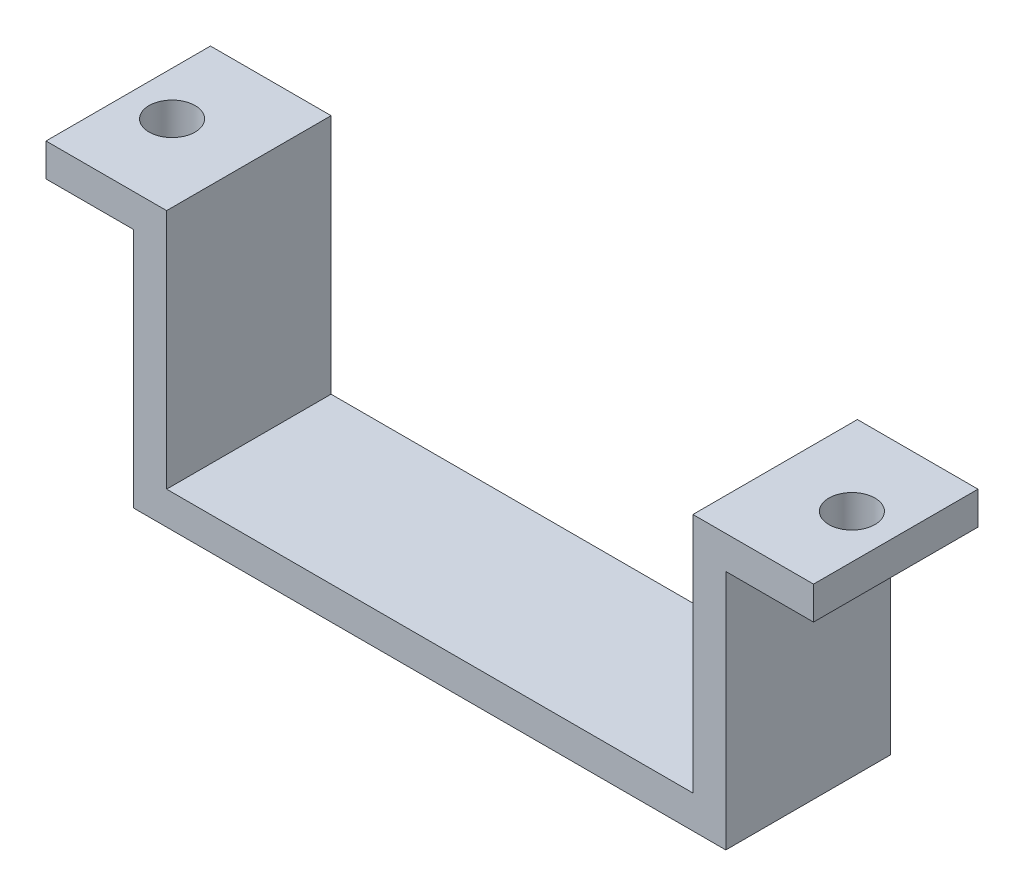
ISO-10303-21;
HEADER;
FILE_DESCRIPTION(('STEP AP214'),'2;1');
FILE_NAME('part.step','',(''),(''),'','','');
FILE_SCHEMA(('AUTOMOTIVE_DESIGN { 1 0 10303 214 1 1 1 1 }'));
ENDSEC;
DATA;
#1=APPLICATION_CONTEXT('core data for automotive mechanical design processes');
#2=APPLICATION_PROTOCOL_DEFINITION('international standard','automotive_design',2000,#1);
#3=PRODUCT_CONTEXT('',#1,'mechanical');
#4=PRODUCT('Part','Part','',(#3));
#5=PRODUCT_RELATED_PRODUCT_CATEGORY('part','',(#4));
#6=PRODUCT_DEFINITION_FORMATION('','',#4);
#7=PRODUCT_DEFINITION_CONTEXT('part definition',#1,'design');
#8=PRODUCT_DEFINITION('design','',#6,#7);
#9=PRODUCT_DEFINITION_SHAPE('','',#8);
#10=(LENGTH_UNIT() NAMED_UNIT(*) SI_UNIT(.MILLI.,.METRE.));
#11=(NAMED_UNIT(*) PLANE_ANGLE_UNIT() SI_UNIT($,.RADIAN.));
#12=(NAMED_UNIT(*) SI_UNIT($,.STERADIAN.) SOLID_ANGLE_UNIT());
#13=UNCERTAINTY_MEASURE_WITH_UNIT(LENGTH_MEASURE(1.E-05),#10,'distance_accuracy_value','');
#14=(GEOMETRIC_REPRESENTATION_CONTEXT(3) GLOBAL_UNCERTAINTY_ASSIGNED_CONTEXT((#13)) GLOBAL_UNIT_ASSIGNED_CONTEXT((#10,
#11,#12)) REPRESENTATION_CONTEXT('',''));
#15=CARTESIAN_POINT('',(0.,0.,0.));
#16=DIRECTION('',(0.,0.,1.));
#17=DIRECTION('',(1.,0.,0.));
#18=AXIS2_PLACEMENT_3D('',#15,#16,#17);
#19=CARTESIAN_POINT('',(27.,25.,-7.5));
#20=DIRECTION('',(-1.,0.,0.));
#21=DIRECTION('',(0.,0.,1.));
#22=AXIS2_PLACEMENT_3D('',#19,#20,#21);
#23=PLANE('',#22);
#24=DIRECTION('',(0.,0.,-1.));
#25=VECTOR('',#24,1.);
#26=CARTESIAN_POINT('',(27.,22.,-7.5));
#27=LINE('',#26,#25);
#28=CARTESIAN_POINT('',(27.,22.,7.5));
#29=VERTEX_POINT('',#28);
#30=CARTESIAN_POINT('',(27.,22.,-7.5));
#31=VERTEX_POINT('',#30);
#32=EDGE_CURVE('E69',#29,#31,#27,.T.);
#33=ORIENTED_EDGE('',*,*,#32,.F.);
#34=DIRECTION('',(0.,-1.,0.));
#35=VECTOR('',#34,1.);
#36=CARTESIAN_POINT('',(27.,25.,7.5));
#37=LINE('',#36,#35);
#38=CARTESIAN_POINT('',(27.,0.,7.5));
#39=VERTEX_POINT('',#38);
#40=EDGE_CURVE('E241',#29,#39,#37,.T.);
#41=ORIENTED_EDGE('',*,*,#40,.T.);
#42=DIRECTION('',(0.,0.,-1.));
#43=VECTOR('',#42,1.);
#44=CARTESIAN_POINT('',(27.,0.,-7.5));
#45=LINE('',#44,#43);
#46=CARTESIAN_POINT('',(27.,0.,-7.5));
#47=VERTEX_POINT('',#46);
#48=EDGE_CURVE('E221',#39,#47,#45,.T.);
#49=ORIENTED_EDGE('',*,*,#48,.T.);
#50=DIRECTION('',(0.,-1.,0.));
#51=VECTOR('',#50,1.);
#52=CARTESIAN_POINT('',(27.,25.,-7.5));
#53=LINE('',#52,#51);
#54=EDGE_CURVE('E238',#31,#47,#53,.T.);
#55=ORIENTED_EDGE('',*,*,#54,.F.);
#56=EDGE_LOOP('',(#33,#41,#49,#55));
#57=FACE_BOUND('',#56,.T.);
#58=ADVANCED_FACE('F43',(#57),#23,.F.);
#59=CARTESIAN_POINT('',(-24.,3.,7.5));
#60=DIRECTION('',(0.,0.,-1.));
#61=DIRECTION('',(-1.,0.,0.));
#62=AXIS2_PLACEMENT_3D('',#59,#60,#61);
#63=PLANE('',#62);
#64=DIRECTION('',(1.,0.,0.));
#65=VECTOR('',#64,1.);
#66=CARTESIAN_POINT('',(-24.,0.,7.5));
#67=LINE('',#66,#65);
#68=CARTESIAN_POINT('',(-27.,0.,7.50000000000002));
#69=VERTEX_POINT('',#68);
#70=EDGE_CURVE('E248',#69,#39,#67,.T.);
#71=ORIENTED_EDGE('',*,*,#70,.T.);
#72=ORIENTED_EDGE('',*,*,#40,.F.);
#73=DIRECTION('',(-1.,0.,0.));
#74=VECTOR('',#73,1.);
#75=CARTESIAN_POINT('',(35.,22.,7.5));
#76=LINE('',#75,#74);
#77=CARTESIAN_POINT('',(35.,22.,7.5));
#78=VERTEX_POINT('',#77);
#79=EDGE_CURVE('E191',#78,#29,#76,.T.);
#80=ORIENTED_EDGE('',*,*,#79,.F.);
#81=DIRECTION('',(0.,-1.,0.));
#82=VECTOR('',#81,1.);
#83=CARTESIAN_POINT('',(35.,22.,7.5));
#84=LINE('',#83,#82);
#85=CARTESIAN_POINT('',(35.,25.,7.5));
#86=VERTEX_POINT('',#85);
#87=EDGE_CURVE('E179',#86,#78,#84,.T.);
#88=ORIENTED_EDGE('',*,*,#87,.F.);
#89=DIRECTION('',(1.,0.,0.));
#90=VECTOR('',#89,1.);
#91=CARTESIAN_POINT('',(24.,25.,7.5));
#92=LINE('',#91,#90);
#93=CARTESIAN_POINT('',(24.,25.,7.5));
#94=VERTEX_POINT('',#93);
#95=EDGE_CURVE('E226',#94,#86,#92,.T.);
#96=ORIENTED_EDGE('',*,*,#95,.F.);
#97=DIRECTION('',(0.,-1.,0.));
#98=VECTOR('',#97,1.);
#99=CARTESIAN_POINT('',(24.,25.,7.5));
#100=LINE('',#99,#98);
#101=CARTESIAN_POINT('',(24.,3.,7.5));
#102=VERTEX_POINT('',#101);
#103=EDGE_CURVE('E244',#94,#102,#100,.T.);
#104=ORIENTED_EDGE('',*,*,#103,.T.);
#105=DIRECTION('',(1.,0.,0.));
#106=VECTOR('',#105,1.);
#107=CARTESIAN_POINT('',(-24.,3.,7.5));
#108=LINE('',#107,#106);
#109=CARTESIAN_POINT('',(-24.,3.,7.5));
#110=VERTEX_POINT('',#109);
#111=EDGE_CURVE('E253',#110,#102,#108,.T.);
#112=ORIENTED_EDGE('',*,*,#111,.F.);
#113=DIRECTION('',(0.,-1.,0.));
#114=VECTOR('',#113,1.);
#115=CARTESIAN_POINT('',(-24.,25.,7.50000000000002));
#116=LINE('',#115,#114);
#117=CARTESIAN_POINT('',(-24.,25.,7.50000000000002));
#118=VERTEX_POINT('',#117);
#119=EDGE_CURVE('E206',#118,#110,#116,.T.);
#120=ORIENTED_EDGE('',*,*,#119,.F.);
#121=DIRECTION('',(1.,0.,0.));
#122=VECTOR('',#121,1.);
#123=CARTESIAN_POINT('',(-24.,25.,7.50000000000002));
#124=LINE('',#123,#122);
#125=CARTESIAN_POINT('',(-35.,25.,7.5));
#126=VERTEX_POINT('',#125);
#127=EDGE_CURVE('E203',#126,#118,#124,.T.);
#128=ORIENTED_EDGE('',*,*,#127,.F.);
#129=DIRECTION('',(0.,-1.,0.));
#130=VECTOR('',#129,1.);
#131=CARTESIAN_POINT('',(-35.,22.,7.5));
#132=LINE('',#131,#130);
#133=CARTESIAN_POINT('',(-35.,22.,7.5));
#134=VERTEX_POINT('',#133);
#135=EDGE_CURVE('E158',#126,#134,#132,.T.);
#136=ORIENTED_EDGE('',*,*,#135,.T.);
#137=DIRECTION('',(1.,0.,0.));
#138=VECTOR('',#137,1.);
#139=CARTESIAN_POINT('',(-35.,22.,7.5));
#140=LINE('',#139,#138);
#141=CARTESIAN_POINT('',(-27.,22.,7.5));
#142=VERTEX_POINT('',#141);
#143=EDGE_CURVE('E143',#134,#142,#140,.T.);
#144=ORIENTED_EDGE('',*,*,#143,.T.);
#145=DIRECTION('',(0.,-1.,0.));
#146=VECTOR('',#145,1.);
#147=CARTESIAN_POINT('',(-27.,25.,7.50000000000002));
#148=LINE('',#147,#146);
#149=EDGE_CURVE('E212',#142,#69,#148,.T.);
#150=ORIENTED_EDGE('',*,*,#149,.T.);
#151=EDGE_LOOP('',(#71,#72,#80,#88,#96,#104,#112,#120,#128,#136,#144,#150));
#152=FACE_BOUND('',#151,.T.);
#153=ADVANCED_FACE('F45',(#152),#63,.F.);
#154=CARTESIAN_POINT('',(-24.,3.,-7.5));
#155=DIRECTION('',(0.,0.,1.));
#156=DIRECTION('',(1.,0.,0.));
#157=AXIS2_PLACEMENT_3D('',#154,#155,#156);
#158=PLANE('',#157);
#159=DIRECTION('',(-1.,0.,0.));
#160=VECTOR('',#159,1.);
#161=CARTESIAN_POINT('',(-24.,0.,-7.5));
#162=LINE('',#161,#160);
#163=CARTESIAN_POINT('',(-27.,0.,-7.49999999999997));
#164=VERTEX_POINT('',#163);
#165=EDGE_CURVE('E254',#47,#164,#162,.T.);
#166=ORIENTED_EDGE('',*,*,#165,.T.);
#167=DIRECTION('',(0.,-1.,0.));
#168=VECTOR('',#167,1.);
#169=CARTESIAN_POINT('',(-27.,25.,-7.49999999999997));
#170=LINE('',#169,#168);
#171=CARTESIAN_POINT('',(-27.,22.,-7.49999999999997));
#172=VERTEX_POINT('',#171);
#173=EDGE_CURVE('E141',#172,#164,#170,.T.);
#174=ORIENTED_EDGE('',*,*,#173,.F.);
#175=DIRECTION('',(1.,0.,0.));
#176=VECTOR('',#175,1.);
#177=CARTESIAN_POINT('',(-35.,22.,-7.5));
#178=LINE('',#177,#176);
#179=CARTESIAN_POINT('',(-35.,22.,-7.5));
#180=VERTEX_POINT('',#179);
#181=EDGE_CURVE('E61',#180,#172,#178,.T.);
#182=ORIENTED_EDGE('',*,*,#181,.F.);
#183=DIRECTION('',(0.,1.,0.));
#184=VECTOR('',#183,1.);
#185=CARTESIAN_POINT('',(-35.,22.,-7.5));
#186=LINE('',#185,#184);
#187=CARTESIAN_POINT('',(-35.,25.,-7.5));
#188=VERTEX_POINT('',#187);
#189=EDGE_CURVE('E139',#180,#188,#186,.T.);
#190=ORIENTED_EDGE('',*,*,#189,.T.);
#191=DIRECTION('',(-1.,0.,0.));
#192=VECTOR('',#191,1.);
#193=CARTESIAN_POINT('',(-24.,25.,-7.49999999999998));
#194=LINE('',#193,#192);
#195=CARTESIAN_POINT('',(-24.,25.,-7.49999999999998));
#196=VERTEX_POINT('',#195);
#197=EDGE_CURVE('E200',#196,#188,#194,.T.);
#198=ORIENTED_EDGE('',*,*,#197,.F.);
#199=DIRECTION('',(0.,-1.,0.));
#200=VECTOR('',#199,1.);
#201=CARTESIAN_POINT('',(-24.,25.,-7.49999999999998));
#202=LINE('',#201,#200);
#203=CARTESIAN_POINT('',(-24.,3.,-7.49999999999998));
#204=VERTEX_POINT('',#203);
#205=EDGE_CURVE('E217',#196,#204,#202,.T.);
#206=ORIENTED_EDGE('',*,*,#205,.T.);
#207=DIRECTION('',(-1.,0.,0.));
#208=VECTOR('',#207,1.);
#209=CARTESIAN_POINT('',(-24.,3.,-7.5));
#210=LINE('',#209,#208);
#211=CARTESIAN_POINT('',(24.,3.,-7.5));
#212=VERTEX_POINT('',#211);
#213=EDGE_CURVE('E11',#212,#204,#210,.T.);
#214=ORIENTED_EDGE('',*,*,#213,.F.);
#215=DIRECTION('',(0.,-1.,0.));
#216=VECTOR('',#215,1.);
#217=CARTESIAN_POINT('',(24.,25.,-7.5));
#218=LINE('',#217,#216);
#219=CARTESIAN_POINT('',(24.,25.,-7.5));
#220=VERTEX_POINT('',#219);
#221=EDGE_CURVE('E232',#220,#212,#218,.T.);
#222=ORIENTED_EDGE('',*,*,#221,.F.);
#223=DIRECTION('',(-1.,0.,0.));
#224=VECTOR('',#223,1.);
#225=CARTESIAN_POINT('',(24.,25.,-7.5));
#226=LINE('',#225,#224);
#227=CARTESIAN_POINT('',(35.,25.,-7.5));
#228=VERTEX_POINT('',#227);
#229=EDGE_CURVE('E229',#228,#220,#226,.T.);
#230=ORIENTED_EDGE('',*,*,#229,.F.);
#231=DIRECTION('',(0.,1.,0.));
#232=VECTOR('',#231,1.);
#233=CARTESIAN_POINT('',(35.,22.,-7.5));
#234=LINE('',#233,#232);
#235=CARTESIAN_POINT('',(35.,22.,-7.5));
#236=VERTEX_POINT('',#235);
#237=EDGE_CURVE('E171',#236,#228,#234,.T.);
#238=ORIENTED_EDGE('',*,*,#237,.F.);
#239=DIRECTION('',(-1.,0.,0.));
#240=VECTOR('',#239,1.);
#241=CARTESIAN_POINT('',(35.,22.,-7.5));
#242=LINE('',#241,#240);
#243=EDGE_CURVE('E185',#236,#31,#242,.T.);
#244=ORIENTED_EDGE('',*,*,#243,.T.);
#245=ORIENTED_EDGE('',*,*,#54,.T.);
#246=EDGE_LOOP('',(#166,#174,#182,#190,#198,#206,#214,#222,#230,#238,#244,#245));
#247=FACE_BOUND('',#246,.T.);
#248=ADVANCED_FACE('F138',(#247),#158,.F.);
#249=CARTESIAN_POINT('',(0.,3.,0.));
#250=DIRECTION('',(0.,1.,0.));
#251=DIRECTION('',(0.,0.,1.));
#252=AXIS2_PLACEMENT_3D('',#249,#250,#251);
#253=PLANE('',#252);
#254=DIRECTION('',(0.,0.,1.));
#255=VECTOR('',#254,1.);
#256=CARTESIAN_POINT('',(-24.,3.,-7.5));
#257=LINE('',#256,#255);
#258=EDGE_CURVE('E249',#204,#110,#257,.T.);
#259=ORIENTED_EDGE('',*,*,#258,.T.);
#260=ORIENTED_EDGE('',*,*,#111,.T.);
#261=DIRECTION('',(0.,0.,-1.));
#262=VECTOR('',#261,1.);
#263=CARTESIAN_POINT('',(24.,3.,-7.5));
#264=LINE('',#263,#262);
#265=EDGE_CURVE('E53',#102,#212,#264,.T.);
#266=ORIENTED_EDGE('',*,*,#265,.T.);
#267=ORIENTED_EDGE('',*,*,#213,.T.);
#268=EDGE_LOOP('',(#259,#260,#266,#267));
#269=FACE_BOUND('',#268,.T.);
#270=ADVANCED_FACE('F309',(#269),#253,.T.);
#271=CARTESIAN_POINT('',(0.,0.,0.));
#272=DIRECTION('',(0.,1.,0.));
#273=DIRECTION('',(0.,0.,1.));
#274=AXIS2_PLACEMENT_3D('',#271,#272,#273);
#275=PLANE('',#274);
#276=ORIENTED_EDGE('',*,*,#70,.F.);
#277=DIRECTION('',(0.,0.,1.));
#278=VECTOR('',#277,1.);
#279=CARTESIAN_POINT('',(-27.,0.,-7.49999999999997));
#280=LINE('',#279,#278);
#281=EDGE_CURVE('E195',#164,#69,#280,.T.);
#282=ORIENTED_EDGE('',*,*,#281,.F.);
#283=ORIENTED_EDGE('',*,*,#165,.F.);
#284=ORIENTED_EDGE('',*,*,#48,.F.);
#285=EDGE_LOOP('',(#276,#282,#283,#284));
#286=FACE_BOUND('',#285,.T.);
#287=ADVANCED_FACE('F307',(#286),#275,.F.);
#288=CARTESIAN_POINT('',(24.,25.,-7.5));
#289=DIRECTION('',(1.,0.,0.));
#290=DIRECTION('',(0.,0.,-1.));
#291=AXIS2_PLACEMENT_3D('',#288,#289,#290);
#292=PLANE('',#291);
#293=ORIENTED_EDGE('',*,*,#265,.F.);
#294=ORIENTED_EDGE('',*,*,#103,.F.);
#295=DIRECTION('',(0.,0.,1.));
#296=VECTOR('',#295,1.);
#297=CARTESIAN_POINT('',(24.,25.,-7.5));
#298=LINE('',#297,#296);
#299=EDGE_CURVE('E222',#220,#94,#298,.T.);
#300=ORIENTED_EDGE('',*,*,#299,.F.);
#301=ORIENTED_EDGE('',*,*,#221,.T.);
#302=EDGE_LOOP('',(#293,#294,#300,#301));
#303=FACE_BOUND('',#302,.T.);
#304=ADVANCED_FACE('F304',(#303),#292,.F.);
#305=CARTESIAN_POINT('',(0.,25.,0.));
#306=DIRECTION('',(0.,1.,0.));
#307=DIRECTION('',(0.,0.,1.));
#308=AXIS2_PLACEMENT_3D('',#305,#306,#307);
#309=PLANE('',#308);
#310=CARTESIAN_POINT('',(31.,25.,0.));
#311=DIRECTION('',(0.,1.,0.));
#312=DIRECTION('',(0.,0.,1.));
#313=AXIS2_PLACEMENT_3D('',#310,#311,#312);
#314=CIRCLE('',#313,2.1);
#315=CARTESIAN_POINT('',(31.,25.,2.1));
#316=VERTEX_POINT('',#315);
#317=EDGE_CURVE('E268',#316,#316,#314,.T.);
#318=ORIENTED_EDGE('',*,*,#317,.F.);
#319=EDGE_LOOP('',(#318));
#320=FACE_BOUND('',#319,.T.);
#321=ORIENTED_EDGE('',*,*,#299,.T.);
#322=ORIENTED_EDGE('',*,*,#95,.T.);
#323=DIRECTION('',(0.,0.,1.));
#324=VECTOR('',#323,1.);
#325=CARTESIAN_POINT('',(35.,25.,-7.5));
#326=LINE('',#325,#324);
#327=EDGE_CURVE('E175',#228,#86,#326,.T.);
#328=ORIENTED_EDGE('',*,*,#327,.F.);
#329=ORIENTED_EDGE('',*,*,#229,.T.);
#330=EDGE_LOOP('',(#321,#322,#328,#329));
#331=FACE_BOUND('',#330,.T.);
#332=ADVANCED_FACE('F302',(#320,#331),#309,.T.);
#333=CARTESIAN_POINT('',(-24.,25.,-7.49999999999998));
#334=DIRECTION('',(-1.,0.,0.));
#335=DIRECTION('',(0.,0.,1.));
#336=AXIS2_PLACEMENT_3D('',#333,#334,#335);
#337=PLANE('',#336);
#338=ORIENTED_EDGE('',*,*,#258,.F.);
#339=ORIENTED_EDGE('',*,*,#205,.F.);
#340=DIRECTION('',(0.,0.,-1.));
#341=VECTOR('',#340,1.);
#342=CARTESIAN_POINT('',(-24.,25.,-7.49999999999998));
#343=LINE('',#342,#341);
#344=EDGE_CURVE('E196',#118,#196,#343,.T.);
#345=ORIENTED_EDGE('',*,*,#344,.F.);
#346=ORIENTED_EDGE('',*,*,#119,.T.);
#347=EDGE_LOOP('',(#338,#339,#345,#346));
#348=FACE_BOUND('',#347,.T.);
#349=ADVANCED_FACE('F340',(#348),#337,.F.);
#350=CARTESIAN_POINT('',(-27.,25.,-7.49999999999997));
#351=DIRECTION('',(1.,0.,0.));
#352=DIRECTION('',(0.,0.,-1.));
#353=AXIS2_PLACEMENT_3D('',#350,#351,#352);
#354=PLANE('',#353);
#355=ORIENTED_EDGE('',*,*,#149,.F.);
#356=DIRECTION('',(0.,0.,-1.));
#357=VECTOR('',#356,1.);
#358=CARTESIAN_POINT('',(-27.,22.,-7.5));
#359=LINE('',#358,#357);
#360=EDGE_CURVE('E154',#142,#172,#359,.T.);
#361=ORIENTED_EDGE('',*,*,#360,.T.);
#362=ORIENTED_EDGE('',*,*,#173,.T.);
#363=ORIENTED_EDGE('',*,*,#281,.T.);
#364=EDGE_LOOP('',(#355,#361,#362,#363));
#365=FACE_BOUND('',#364,.T.);
#366=ADVANCED_FACE('F348',(#365),#354,.F.);
#367=CARTESIAN_POINT('',(0.,25.,0.));
#368=DIRECTION('',(0.,-1.,0.));
#369=DIRECTION('',(0.,0.,-1.));
#370=AXIS2_PLACEMENT_3D('',#367,#368,#369);
#371=PLANE('',#370);
#372=CARTESIAN_POINT('',(-31.,25.,0.));
#373=DIRECTION('',(0.,-1.,0.));
#374=DIRECTION('',(0.,0.,-1.));
#375=AXIS2_PLACEMENT_3D('',#372,#373,#374);
#376=CIRCLE('',#375,2.1);
#377=CARTESIAN_POINT('',(-31.,25.,-2.1));
#378=VERTEX_POINT('',#377);
#379=EDGE_CURVE('E168',#378,#378,#376,.F.);
#380=ORIENTED_EDGE('',*,*,#379,.F.);
#381=EDGE_LOOP('',(#380));
#382=FACE_BOUND('',#381,.T.);
#383=ORIENTED_EDGE('',*,*,#344,.T.);
#384=ORIENTED_EDGE('',*,*,#197,.T.);
#385=DIRECTION('',(0.,0.,1.));
#386=VECTOR('',#385,1.);
#387=CARTESIAN_POINT('',(-35.,25.,-7.5));
#388=LINE('',#387,#386);
#389=EDGE_CURVE('E152',#188,#126,#388,.T.);
#390=ORIENTED_EDGE('',*,*,#389,.T.);
#391=ORIENTED_EDGE('',*,*,#127,.T.);
#392=EDGE_LOOP('',(#383,#384,#390,#391));
#393=FACE_BOUND('',#392,.T.);
#394=ADVANCED_FACE('F354',(#382,#393),#371,.F.);
#395=CARTESIAN_POINT('',(35.,22.,-7.5));
#396=DIRECTION('',(0.,1.,0.));
#397=DIRECTION('',(0.,0.,1.));
#398=AXIS2_PLACEMENT_3D('',#395,#396,#397);
#399=PLANE('',#398);
#400=CARTESIAN_POINT('',(31.,22.,0.));
#401=DIRECTION('',(0.,1.,0.));
#402=DIRECTION('',(0.,0.,1.));
#403=AXIS2_PLACEMENT_3D('',#400,#401,#402);
#404=CIRCLE('',#403,2.1);
#405=CARTESIAN_POINT('',(31.,22.,2.1));
#406=VERTEX_POINT('',#405);
#407=EDGE_CURVE('E47',#406,#406,#404,.T.);
#408=ORIENTED_EDGE('',*,*,#407,.T.);
#409=EDGE_LOOP('',(#408));
#410=FACE_BOUND('',#409,.T.);
#411=ORIENTED_EDGE('',*,*,#32,.T.);
#412=ORIENTED_EDGE('',*,*,#243,.F.);
#413=DIRECTION('',(0.,0.,-1.));
#414=VECTOR('',#413,1.);
#415=CARTESIAN_POINT('',(35.,22.,-7.5));
#416=LINE('',#415,#414);
#417=EDGE_CURVE('E182',#78,#236,#416,.T.);
#418=ORIENTED_EDGE('',*,*,#417,.F.);
#419=ORIENTED_EDGE('',*,*,#79,.T.);
#420=EDGE_LOOP('',(#411,#412,#418,#419));
#421=FACE_BOUND('',#420,.T.);
#422=ADVANCED_FACE('F282',(#410,#421),#399,.F.);
#423=CARTESIAN_POINT('',(35.,0.,0.));
#424=DIRECTION('',(1.,0.,0.));
#425=DIRECTION('',(0.,0.,-1.));
#426=AXIS2_PLACEMENT_3D('',#423,#424,#425);
#427=PLANE('',#426);
#428=ORIENTED_EDGE('',*,*,#237,.T.);
#429=ORIENTED_EDGE('',*,*,#327,.T.);
#430=ORIENTED_EDGE('',*,*,#87,.T.);
#431=ORIENTED_EDGE('',*,*,#417,.T.);
#432=EDGE_LOOP('',(#428,#429,#430,#431));
#433=FACE_BOUND('',#432,.T.);
#434=ADVANCED_FACE('F370',(#433),#427,.T.);
#435=CARTESIAN_POINT('',(-35.,22.,-7.5));
#436=DIRECTION('',(0.,-1.,0.));
#437=DIRECTION('',(0.,0.,-1.));
#438=AXIS2_PLACEMENT_3D('',#435,#436,#437);
#439=PLANE('',#438);
#440=CARTESIAN_POINT('',(-31.,22.,0.));
#441=DIRECTION('',(0.,-1.,0.));
#442=DIRECTION('',(0.,0.,-1.));
#443=AXIS2_PLACEMENT_3D('',#440,#441,#442);
#444=CIRCLE('',#443,2.1);
#445=CARTESIAN_POINT('',(-31.,22.,-2.1));
#446=VERTEX_POINT('',#445);
#447=EDGE_CURVE('E265',#446,#446,#444,.F.);
#448=ORIENTED_EDGE('',*,*,#447,.T.);
#449=EDGE_LOOP('',(#448));
#450=FACE_BOUND('',#449,.T.);
#451=ORIENTED_EDGE('',*,*,#360,.F.);
#452=ORIENTED_EDGE('',*,*,#143,.F.);
#453=DIRECTION('',(0.,0.,-1.));
#454=VECTOR('',#453,1.);
#455=CARTESIAN_POINT('',(-35.,22.,-7.5));
#456=LINE('',#455,#454);
#457=EDGE_CURVE('E149',#134,#180,#456,.T.);
#458=ORIENTED_EDGE('',*,*,#457,.T.);
#459=ORIENTED_EDGE('',*,*,#181,.T.);
#460=EDGE_LOOP('',(#451,#452,#458,#459));
#461=FACE_BOUND('',#460,.T.);
#462=ADVANCED_FACE('F156',(#450,#461),#439,.T.);
#463=CARTESIAN_POINT('',(-35.,0.,0.));
#464=DIRECTION('',(-1.,0.,0.));
#465=DIRECTION('',(0.,0.,-1.));
#466=AXIS2_PLACEMENT_3D('',#463,#464,#465);
#467=PLANE('',#466);
#468=ORIENTED_EDGE('',*,*,#189,.F.);
#469=ORIENTED_EDGE('',*,*,#457,.F.);
#470=ORIENTED_EDGE('',*,*,#135,.F.);
#471=ORIENTED_EDGE('',*,*,#389,.F.);
#472=EDGE_LOOP('',(#468,#469,#470,#471));
#473=FACE_BOUND('',#472,.T.);
#474=ADVANCED_FACE('F147',(#473),#467,.T.);
#475=CARTESIAN_POINT('',(-31.,100.,0.));
#476=DIRECTION('',(0.,-1.,0.));
#477=DIRECTION('',(0.,0.,-1.));
#478=AXIS2_PLACEMENT_3D('',#475,#476,#477);
#479=CYLINDRICAL_SURFACE('',#478,2.1);
#480=ORIENTED_EDGE('',*,*,#447,.F.);
#481=EDGE_LOOP('',(#480));
#482=FACE_BOUND('',#481,.T.);
#483=ORIENTED_EDGE('',*,*,#379,.T.);
#484=EDGE_LOOP('',(#483));
#485=FACE_BOUND('',#484,.T.);
#486=ADVANCED_FACE('F287',(#482,#485),#479,.F.);
#487=CARTESIAN_POINT('',(31.,100.,0.));
#488=DIRECTION('',(0.,-1.,0.));
#489=DIRECTION('',(0.,0.,-1.));
#490=AXIS2_PLACEMENT_3D('',#487,#488,#489);
#491=CYLINDRICAL_SURFACE('',#490,2.1);
#492=ORIENTED_EDGE('',*,*,#317,.T.);
#493=EDGE_LOOP('',(#492));
#494=FACE_BOUND('',#493,.T.);
#495=ORIENTED_EDGE('',*,*,#407,.F.);
#496=EDGE_LOOP('',(#495));
#497=FACE_BOUND('',#496,.T.);
#498=ADVANCED_FACE('F285',(#494,#497),#491,.F.);
#499=CLOSED_SHELL('',(#58,#153,#248,#270,#287,#304,#332,#349,#366,#394,#422,#434,#462,#474,#486,#498));
#500=MANIFOLD_SOLID_BREP('B2',#499);
#501=ADVANCED_BREP_SHAPE_REPRESENTATION('',(#18,#500),#14);
#502=SHAPE_DEFINITION_REPRESENTATION(#9,#501);
ENDSEC;
END-ISO-10303-21;
